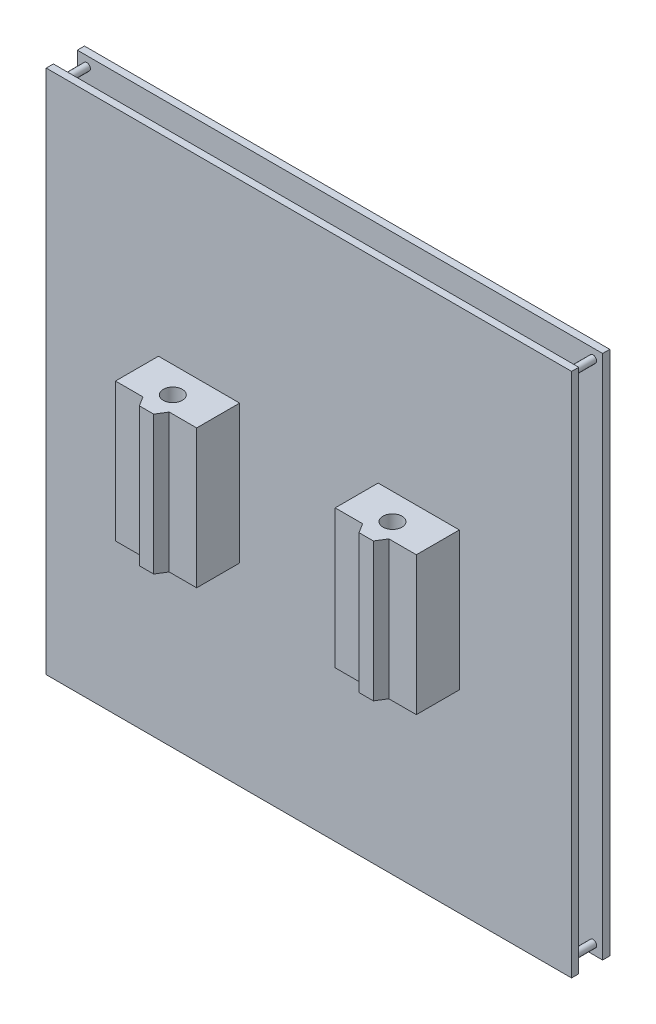
ISO-10303-21;
HEADER;
FILE_DESCRIPTION(('STEP AP214'),'2;1');
FILE_NAME('part.step','',(''),(''),'','','');
FILE_SCHEMA(('AUTOMOTIVE_DESIGN { 1 0 10303 214 1 1 1 1 }'));
ENDSEC;
DATA;
#1=APPLICATION_CONTEXT('core data for automotive mechanical design processes');
#2=APPLICATION_PROTOCOL_DEFINITION('international standard','automotive_design',2000,#1);
#3=PRODUCT_CONTEXT('',#1,'mechanical');
#4=PRODUCT('Part','Part','',(#3));
#5=PRODUCT_RELATED_PRODUCT_CATEGORY('part','',(#4));
#6=PRODUCT_DEFINITION_FORMATION('','',#4);
#7=PRODUCT_DEFINITION_CONTEXT('part definition',#1,'design');
#8=PRODUCT_DEFINITION('design','',#6,#7);
#9=PRODUCT_DEFINITION_SHAPE('','',#8);
#10=(LENGTH_UNIT() NAMED_UNIT(*) SI_UNIT(.MILLI.,.METRE.));
#11=(NAMED_UNIT(*) PLANE_ANGLE_UNIT() SI_UNIT($,.RADIAN.));
#12=(NAMED_UNIT(*) SI_UNIT($,.STERADIAN.) SOLID_ANGLE_UNIT());
#13=UNCERTAINTY_MEASURE_WITH_UNIT(LENGTH_MEASURE(1.E-05),#10,'distance_accuracy_value','');
#14=(GEOMETRIC_REPRESENTATION_CONTEXT(3) GLOBAL_UNCERTAINTY_ASSIGNED_CONTEXT((#13)) GLOBAL_UNIT_ASSIGNED_CONTEXT((#10,
#11,#12)) REPRESENTATION_CONTEXT('',''));
#15=CARTESIAN_POINT('',(0.,0.,0.));
#16=DIRECTION('',(0.,0.,1.));
#17=DIRECTION('',(1.,0.,0.));
#18=AXIS2_PLACEMENT_3D('',#15,#16,#17);
#19=CARTESIAN_POINT('',(63.,29.,38.));
#20=DIRECTION('',(1.,0.,0.));
#21=DIRECTION('',(0.,0.,-1.));
#22=AXIS2_PLACEMENT_3D('',#19,#20,#21);
#23=PLANE('',#22);
#24=DIRECTION('',(0.,0.,-1.));
#25=VECTOR('',#24,1.);
#26=CARTESIAN_POINT('',(63.,29.,38.));
#27=LINE('',#26,#25);
#28=CARTESIAN_POINT('',(63.,29.,34.));
#29=VERTEX_POINT('',#28);
#30=CARTESIAN_POINT('',(63.,29.,16.));
#31=VERTEX_POINT('',#30);
#32=EDGE_CURVE('E254',#29,#31,#27,.T.);
#33=ORIENTED_EDGE('',*,*,#32,.F.);
#34=DIRECTION('',(0.,1.,0.));
#35=VECTOR('',#34,1.);
#36=CARTESIAN_POINT('',(63.,-110.,34.));
#37=LINE('',#36,#35);
#38=CARTESIAN_POINT('',(63.,-29.,34.));
#39=VERTEX_POINT('',#38);
#40=EDGE_CURVE('E217',#39,#29,#37,.T.);
#41=ORIENTED_EDGE('',*,*,#40,.F.);
#42=DIRECTION('',(0.,0.,-1.));
#43=VECTOR('',#42,1.);
#44=CARTESIAN_POINT('',(63.,-29.,38.));
#45=LINE('',#44,#43);
#46=CARTESIAN_POINT('',(63.,-29.,16.));
#47=VERTEX_POINT('',#46);
#48=EDGE_CURVE('E238',#39,#47,#45,.T.);
#49=ORIENTED_EDGE('',*,*,#48,.T.);
#50=DIRECTION('',(0.,-1.,0.));
#51=VECTOR('',#50,1.);
#52=CARTESIAN_POINT('',(63.,29.,16.));
#53=LINE('',#52,#51);
#54=EDGE_CURVE('E232',#31,#47,#53,.T.);
#55=ORIENTED_EDGE('',*,*,#54,.F.);
#56=EDGE_LOOP('',(#33,#41,#49,#55));
#57=FACE_BOUND('',#56,.T.);
#58=ADVANCED_FACE('F33',(#57),#23,.T.);
#59=CARTESIAN_POINT('',(63.,29.,38.));
#60=DIRECTION('',(0.,1.,0.));
#61=DIRECTION('',(0.,0.,1.));
#62=AXIS2_PLACEMENT_3D('',#59,#60,#61);
#63=PLANE('',#62);
#64=CARTESIAN_POINT('',(46.,29.,27.));
#65=DIRECTION('',(0.,1.,0.));
#66=DIRECTION('',(0.,0.,1.));
#67=AXIS2_PLACEMENT_3D('',#64,#65,#66);
#68=CIRCLE('',#67,4.00000000000001);
#69=CARTESIAN_POINT('',(46.,29.,31.));
#70=VERTEX_POINT('',#69);
#71=EDGE_CURVE('E229',#70,#70,#68,.F.);
#72=ORIENTED_EDGE('',*,*,#71,.T.);
#73=EDGE_LOOP('',(#72));
#74=FACE_BOUND('',#73,.T.);
#75=DIRECTION('',(1.,0.,0.));
#76=VECTOR('',#75,1.);
#77=CARTESIAN_POINT('',(63.,29.,38.));
#78=LINE('',#77,#76);
#79=CARTESIAN_POINT('',(43.,29.,38.));
#80=VERTEX_POINT('',#79);
#81=CARTESIAN_POINT('',(49.,29.,38.));
#82=VERTEX_POINT('',#81);
#83=EDGE_CURVE('E233',#80,#82,#78,.T.);
#84=ORIENTED_EDGE('',*,*,#83,.T.);
#85=DIRECTION('',(0.529998940003179,0.,-0.847998304005089));
#86=VECTOR('',#85,1.);
#87=CARTESIAN_POINT('',(52.9325842696629,29.,31.7078651685393));
#88=LINE('',#87,#86);
#89=CARTESIAN_POINT('',(51.5,29.,34.));
#90=VERTEX_POINT('',#89);
#91=EDGE_CURVE('E56',#82,#90,#88,.T.);
#92=ORIENTED_EDGE('',*,*,#91,.T.);
#93=DIRECTION('',(1.,0.,0.));
#94=VECTOR('',#93,1.);
#95=CARTESIAN_POINT('',(63.,29.,34.));
#96=LINE('',#95,#94);
#97=EDGE_CURVE('E225',#90,#29,#96,.T.);
#98=ORIENTED_EDGE('',*,*,#97,.T.);
#99=ORIENTED_EDGE('',*,*,#32,.T.);
#100=DIRECTION('',(1.,0.,0.));
#101=VECTOR('',#100,1.);
#102=CARTESIAN_POINT('',(63.,29.,16.));
#103=LINE('',#102,#101);
#104=CARTESIAN_POINT('',(29.,29.,16.));
#105=VERTEX_POINT('',#104);
#106=EDGE_CURVE('E241',#105,#31,#103,.T.);
#107=ORIENTED_EDGE('',*,*,#106,.F.);
#108=DIRECTION('',(0.,0.,-1.));
#109=VECTOR('',#108,1.);
#110=CARTESIAN_POINT('',(29.,29.,38.));
#111=LINE('',#110,#109);
#112=CARTESIAN_POINT('',(29.,29.,34.));
#113=VERTEX_POINT('',#112);
#114=EDGE_CURVE('E252',#113,#105,#111,.T.);
#115=ORIENTED_EDGE('',*,*,#114,.F.);
#116=DIRECTION('',(1.,0.,0.));
#117=VECTOR('',#116,1.);
#118=CARTESIAN_POINT('',(63.,29.,34.));
#119=LINE('',#118,#117);
#120=CARTESIAN_POINT('',(40.5,29.,34.));
#121=VERTEX_POINT('',#120);
#122=EDGE_CURVE('E223',#113,#121,#119,.T.);
#123=ORIENTED_EDGE('',*,*,#122,.T.);
#124=DIRECTION('',(0.529998940003179,0.,0.847998304005089));
#125=VECTOR('',#124,1.);
#126=CARTESIAN_POINT('',(48.6179775280899,29.,46.9887640449438));
#127=LINE('',#126,#125);
#128=EDGE_CURVE('E206',#121,#80,#127,.T.);
#129=ORIENTED_EDGE('',*,*,#128,.T.);
#130=EDGE_LOOP('',(#84,#92,#98,#99,#107,#115,#123,#129));
#131=FACE_BOUND('',#130,.T.);
#132=ADVANCED_FACE('F419',(#74,#131),#63,.T.);
#133=CARTESIAN_POINT('',(29.,29.,38.));
#134=DIRECTION('',(-1.,0.,0.));
#135=DIRECTION('',(0.,0.,1.));
#136=AXIS2_PLACEMENT_3D('',#133,#134,#135);
#137=PLANE('',#136);
#138=DIRECTION('',(0.,0.,-1.));
#139=VECTOR('',#138,1.);
#140=CARTESIAN_POINT('',(29.,-29.,38.));
#141=LINE('',#140,#139);
#142=CARTESIAN_POINT('',(29.,-29.,34.));
#143=VERTEX_POINT('',#142);
#144=CARTESIAN_POINT('',(29.,-29.,16.));
#145=VERTEX_POINT('',#144);
#146=EDGE_CURVE('E250',#143,#145,#141,.T.);
#147=ORIENTED_EDGE('',*,*,#146,.F.);
#148=DIRECTION('',(0.,1.,0.));
#149=VECTOR('',#148,1.);
#150=CARTESIAN_POINT('',(29.,-110.,34.));
#151=LINE('',#150,#149);
#152=EDGE_CURVE('E200',#143,#113,#151,.T.);
#153=ORIENTED_EDGE('',*,*,#152,.T.);
#154=ORIENTED_EDGE('',*,*,#114,.T.);
#155=DIRECTION('',(0.,1.,0.));
#156=VECTOR('',#155,1.);
#157=CARTESIAN_POINT('',(29.,29.,16.));
#158=LINE('',#157,#156);
#159=EDGE_CURVE('E244',#145,#105,#158,.T.);
#160=ORIENTED_EDGE('',*,*,#159,.F.);
#161=EDGE_LOOP('',(#147,#153,#154,#160));
#162=FACE_BOUND('',#161,.T.);
#163=ADVANCED_FACE('F423',(#162),#137,.T.);
#164=CARTESIAN_POINT('',(63.,-29.,38.));
#165=DIRECTION('',(0.,-1.,0.));
#166=DIRECTION('',(0.,0.,-1.));
#167=AXIS2_PLACEMENT_3D('',#164,#165,#166);
#168=PLANE('',#167);
#169=CARTESIAN_POINT('',(46.,-29.,27.));
#170=DIRECTION('',(0.,-1.,0.));
#171=DIRECTION('',(0.,0.,-1.));
#172=AXIS2_PLACEMENT_3D('',#169,#170,#171);
#173=CIRCLE('',#172,4.00000000000001);
#174=CARTESIAN_POINT('',(46.,-29.,23.));
#175=VERTEX_POINT('',#174);
#176=EDGE_CURVE('E228',#175,#175,#173,.F.);
#177=ORIENTED_EDGE('',*,*,#176,.T.);
#178=EDGE_LOOP('',(#177));
#179=FACE_BOUND('',#178,.T.);
#180=DIRECTION('',(-1.,0.,0.));
#181=VECTOR('',#180,1.);
#182=CARTESIAN_POINT('',(63.,-29.,34.));
#183=LINE('',#182,#181);
#184=CARTESIAN_POINT('',(51.5,-29.,34.));
#185=VERTEX_POINT('',#184);
#186=EDGE_CURVE('E11',#39,#185,#183,.T.);
#187=ORIENTED_EDGE('',*,*,#186,.T.);
#188=DIRECTION('',(-0.529998940003179,0.,0.847998304005089));
#189=VECTOR('',#188,1.);
#190=CARTESIAN_POINT('',(52.9325842696629,-29.,31.7078651685393));
#191=LINE('',#190,#189);
#192=CARTESIAN_POINT('',(49.,-29.,38.));
#193=VERTEX_POINT('',#192);
#194=EDGE_CURVE('E215',#185,#193,#191,.T.);
#195=ORIENTED_EDGE('',*,*,#194,.T.);
#196=DIRECTION('',(-1.,0.,0.));
#197=VECTOR('',#196,1.);
#198=CARTESIAN_POINT('',(63.,-29.,38.));
#199=LINE('',#198,#197);
#200=CARTESIAN_POINT('',(43.,-29.,38.));
#201=VERTEX_POINT('',#200);
#202=EDGE_CURVE('E212',#193,#201,#199,.T.);
#203=ORIENTED_EDGE('',*,*,#202,.T.);
#204=DIRECTION('',(-0.529998940003179,0.,-0.847998304005089));
#205=VECTOR('',#204,1.);
#206=CARTESIAN_POINT('',(48.6179775280899,-29.,46.9887640449438));
#207=LINE('',#206,#205);
#208=CARTESIAN_POINT('',(40.5,-29.,34.));
#209=VERTEX_POINT('',#208);
#210=EDGE_CURVE('E48',#201,#209,#207,.T.);
#211=ORIENTED_EDGE('',*,*,#210,.T.);
#212=DIRECTION('',(-1.,0.,0.));
#213=VECTOR('',#212,1.);
#214=CARTESIAN_POINT('',(63.,-29.,34.));
#215=LINE('',#214,#213);
#216=EDGE_CURVE('E41',#209,#143,#215,.T.);
#217=ORIENTED_EDGE('',*,*,#216,.T.);
#218=ORIENTED_EDGE('',*,*,#146,.T.);
#219=DIRECTION('',(-1.,0.,0.));
#220=VECTOR('',#219,1.);
#221=CARTESIAN_POINT('',(63.,-29.,16.));
#222=LINE('',#221,#220);
#223=EDGE_CURVE('E236',#47,#145,#222,.T.);
#224=ORIENTED_EDGE('',*,*,#223,.F.);
#225=ORIENTED_EDGE('',*,*,#48,.F.);
#226=EDGE_LOOP('',(#187,#195,#203,#211,#217,#218,#224,#225));
#227=FACE_BOUND('',#226,.T.);
#228=ADVANCED_FACE('F209',(#179,#227),#168,.T.);
#229=CARTESIAN_POINT('',(0.,0.,38.));
#230=DIRECTION('',(0.,0.,1.));
#231=DIRECTION('',(-1.,0.,0.));
#232=AXIS2_PLACEMENT_3D('',#229,#230,#231);
#233=PLANE('',#232);
#234=ORIENTED_EDGE('',*,*,#202,.F.);
#235=DIRECTION('',(0.,1.,0.));
#236=VECTOR('',#235,1.);
#237=CARTESIAN_POINT('',(49.,0.,38.));
#238=LINE('',#237,#236);
#239=EDGE_CURVE('E203',#193,#82,#238,.T.);
#240=ORIENTED_EDGE('',*,*,#239,.T.);
#241=ORIENTED_EDGE('',*,*,#83,.F.);
#242=DIRECTION('',(0.,-1.,0.));
#243=VECTOR('',#242,1.);
#244=CARTESIAN_POINT('',(43.,0.,38.));
#245=LINE('',#244,#243);
#246=EDGE_CURVE('E411',#80,#201,#245,.T.);
#247=ORIENTED_EDGE('',*,*,#246,.T.);
#248=EDGE_LOOP('',(#234,#240,#241,#247));
#249=FACE_BOUND('',#248,.T.);
#250=ADVANCED_FACE('F417',(#249),#233,.T.);
#251=CARTESIAN_POINT('',(0.,0.,16.));
#252=DIRECTION('',(0.,0.,1.));
#253=DIRECTION('',(1.,0.,0.));
#254=AXIS2_PLACEMENT_3D('',#251,#252,#253);
#255=PLANE('',#254);
#256=ORIENTED_EDGE('',*,*,#54,.T.);
#257=ORIENTED_EDGE('',*,*,#223,.T.);
#258=ORIENTED_EDGE('',*,*,#159,.T.);
#259=ORIENTED_EDGE('',*,*,#106,.T.);
#260=EDGE_LOOP('',(#256,#257,#258,#259));
#261=FACE_BOUND('',#260,.T.);
#262=DIRECTION('',(0.,-1.,0.));
#263=VECTOR('',#262,1.);
#264=CARTESIAN_POINT('',(-110.,110.,16.));
#265=LINE('',#264,#263);
#266=CARTESIAN_POINT('',(-110.,110.,16.));
#267=VERTEX_POINT('',#266);
#268=CARTESIAN_POINT('',(-110.,-110.,16.));
#269=VERTEX_POINT('',#268);
#270=EDGE_CURVE('E316',#267,#269,#265,.T.);
#271=ORIENTED_EDGE('',*,*,#270,.T.);
#272=DIRECTION('',(1.,0.,0.));
#273=VECTOR('',#272,1.);
#274=CARTESIAN_POINT('',(-110.,-110.,16.));
#275=LINE('',#274,#273);
#276=CARTESIAN_POINT('',(110.,-110.,16.));
#277=VERTEX_POINT('',#276);
#278=EDGE_CURVE('E319',#269,#277,#275,.T.);
#279=ORIENTED_EDGE('',*,*,#278,.T.);
#280=DIRECTION('',(0.,1.,0.));
#281=VECTOR('',#280,1.);
#282=CARTESIAN_POINT('',(110.,110.,16.));
#283=LINE('',#282,#281);
#284=CARTESIAN_POINT('',(110.,110.,16.));
#285=VERTEX_POINT('',#284);
#286=EDGE_CURVE('E322',#277,#285,#283,.T.);
#287=ORIENTED_EDGE('',*,*,#286,.T.);
#288=DIRECTION('',(-1.,0.,0.));
#289=VECTOR('',#288,1.);
#290=CARTESIAN_POINT('',(-110.,110.,16.));
#291=LINE('',#290,#289);
#292=EDGE_CURVE('E324',#285,#267,#291,.T.);
#293=ORIENTED_EDGE('',*,*,#292,.T.);
#294=EDGE_LOOP('',(#271,#279,#287,#293));
#295=FACE_BOUND('',#294,.T.);
#296=DIRECTION('',(1.,0.,0.));
#297=VECTOR('',#296,1.);
#298=CARTESIAN_POINT('',(-63.,-29.,16.));
#299=LINE('',#298,#297);
#300=CARTESIAN_POINT('',(-63.,-29.,16.));
#301=VERTEX_POINT('',#300);
#302=CARTESIAN_POINT('',(-29.,-29.,16.));
#303=VERTEX_POINT('',#302);
#304=EDGE_CURVE('E300',#301,#303,#299,.T.);
#305=ORIENTED_EDGE('',*,*,#304,.F.);
#306=DIRECTION('',(0.,-1.,0.));
#307=VECTOR('',#306,1.);
#308=CARTESIAN_POINT('',(-63.,29.,16.));
#309=LINE('',#308,#307);
#310=CARTESIAN_POINT('',(-63.,29.,16.));
#311=VERTEX_POINT('',#310);
#312=EDGE_CURVE('E289',#311,#301,#309,.T.);
#313=ORIENTED_EDGE('',*,*,#312,.F.);
#314=DIRECTION('',(-1.,0.,0.));
#315=VECTOR('',#314,1.);
#316=CARTESIAN_POINT('',(-63.,29.,16.));
#317=LINE('',#316,#315);
#318=CARTESIAN_POINT('',(-29.,29.,16.));
#319=VERTEX_POINT('',#318);
#320=EDGE_CURVE('E294',#319,#311,#317,.T.);
#321=ORIENTED_EDGE('',*,*,#320,.F.);
#322=DIRECTION('',(0.,1.,0.));
#323=VECTOR('',#322,1.);
#324=CARTESIAN_POINT('',(-29.,29.,16.));
#325=LINE('',#324,#323);
#326=EDGE_CURVE('E303',#303,#319,#325,.T.);
#327=ORIENTED_EDGE('',*,*,#326,.F.);
#328=EDGE_LOOP('',(#305,#313,#321,#327));
#329=FACE_BOUND('',#328,.T.);
#330=ADVANCED_FACE('F436',(#261,#295,#329),#255,.T.);
#331=CARTESIAN_POINT('',(-110.,110.,3.));
#332=DIRECTION('',(1.,0.,0.));
#333=DIRECTION('',(0.,1.,0.));
#334=AXIS2_PLACEMENT_3D('',#331,#332,#333);
#335=PLANE('',#334);
#336=DIRECTION('',(0.,-1.,0.));
#337=VECTOR('',#336,1.);
#338=CARTESIAN_POINT('',(-110.,110.,0.));
#339=LINE('',#338,#337);
#340=CARTESIAN_POINT('',(-110.,110.,0.));
#341=VERTEX_POINT('',#340);
#342=CARTESIAN_POINT('',(-110.,-110.,0.));
#343=VERTEX_POINT('',#342);
#344=EDGE_CURVE('E367',#341,#343,#339,.T.);
#345=ORIENTED_EDGE('',*,*,#344,.T.);
#346=DIRECTION('',(0.,0.,-1.));
#347=VECTOR('',#346,1.);
#348=CARTESIAN_POINT('',(-110.,-110.,3.));
#349=LINE('',#348,#347);
#350=CARTESIAN_POINT('',(-110.,-110.,3.));
#351=VERTEX_POINT('',#350);
#352=EDGE_CURVE('E396',#351,#343,#349,.T.);
#353=ORIENTED_EDGE('',*,*,#352,.F.);
#354=DIRECTION('',(0.,-1.,0.));
#355=VECTOR('',#354,1.);
#356=CARTESIAN_POINT('',(-110.,110.,3.));
#357=LINE('',#356,#355);
#358=CARTESIAN_POINT('',(-110.,110.,3.));
#359=VERTEX_POINT('',#358);
#360=EDGE_CURVE('E370',#359,#351,#357,.T.);
#361=ORIENTED_EDGE('',*,*,#360,.F.);
#362=DIRECTION('',(0.,0.,-1.));
#363=VECTOR('',#362,1.);
#364=CARTESIAN_POINT('',(-110.,110.,3.));
#365=LINE('',#364,#363);
#366=EDGE_CURVE('E380',#359,#341,#365,.T.);
#367=ORIENTED_EDGE('',*,*,#366,.T.);
#368=EDGE_LOOP('',(#345,#353,#361,#367));
#369=FACE_BOUND('',#368,.T.);
#370=ADVANCED_FACE('F35',(#369),#335,.F.);
#371=CARTESIAN_POINT('',(-110.,-110.,3.));
#372=DIRECTION('',(0.,1.,0.));
#373=DIRECTION('',(0.,0.,1.));
#374=AXIS2_PLACEMENT_3D('',#371,#372,#373);
#375=PLANE('',#374);
#376=DIRECTION('',(1.,0.,0.));
#377=VECTOR('',#376,1.);
#378=CARTESIAN_POINT('',(-110.,-110.,0.));
#379=LINE('',#378,#377);
#380=CARTESIAN_POINT('',(110.,-110.,0.));
#381=VERTEX_POINT('',#380);
#382=EDGE_CURVE('E383',#343,#381,#379,.T.);
#383=ORIENTED_EDGE('',*,*,#382,.T.);
#384=DIRECTION('',(0.,0.,-1.));
#385=VECTOR('',#384,1.);
#386=CARTESIAN_POINT('',(110.,-110.,3.));
#387=LINE('',#386,#385);
#388=CARTESIAN_POINT('',(110.,-110.,3.));
#389=VERTEX_POINT('',#388);
#390=EDGE_CURVE('E393',#389,#381,#387,.T.);
#391=ORIENTED_EDGE('',*,*,#390,.F.);
#392=DIRECTION('',(1.,0.,0.));
#393=VECTOR('',#392,1.);
#394=CARTESIAN_POINT('',(-110.,-110.,3.));
#395=LINE('',#394,#393);
#396=EDGE_CURVE('E373',#351,#389,#395,.T.);
#397=ORIENTED_EDGE('',*,*,#396,.F.);
#398=ORIENTED_EDGE('',*,*,#352,.T.);
#399=EDGE_LOOP('',(#383,#391,#397,#398));
#400=FACE_BOUND('',#399,.T.);
#401=ADVANCED_FACE('F549',(#400),#375,.F.);
#402=CARTESIAN_POINT('',(110.,110.,3.));
#403=DIRECTION('',(-1.,0.,0.));
#404=DIRECTION('',(0.,0.,1.));
#405=AXIS2_PLACEMENT_3D('',#402,#403,#404);
#406=PLANE('',#405);
#407=DIRECTION('',(0.,1.,0.));
#408=VECTOR('',#407,1.);
#409=CARTESIAN_POINT('',(110.,110.,0.));
#410=LINE('',#409,#408);
#411=CARTESIAN_POINT('',(110.,110.,0.));
#412=VERTEX_POINT('',#411);
#413=EDGE_CURVE('E385',#381,#412,#410,.T.);
#414=ORIENTED_EDGE('',*,*,#413,.T.);
#415=DIRECTION('',(0.,0.,-1.));
#416=VECTOR('',#415,1.);
#417=CARTESIAN_POINT('',(110.,110.,3.));
#418=LINE('',#417,#416);
#419=CARTESIAN_POINT('',(110.,110.,3.));
#420=VERTEX_POINT('',#419);
#421=EDGE_CURVE('E390',#420,#412,#418,.T.);
#422=ORIENTED_EDGE('',*,*,#421,.F.);
#423=DIRECTION('',(0.,1.,0.));
#424=VECTOR('',#423,1.);
#425=CARTESIAN_POINT('',(110.,110.,3.));
#426=LINE('',#425,#424);
#427=EDGE_CURVE('E376',#389,#420,#426,.T.);
#428=ORIENTED_EDGE('',*,*,#427,.F.);
#429=ORIENTED_EDGE('',*,*,#390,.T.);
#430=EDGE_LOOP('',(#414,#422,#428,#429));
#431=FACE_BOUND('',#430,.T.);
#432=ADVANCED_FACE('F546',(#431),#406,.F.);
#433=CARTESIAN_POINT('',(-110.,110.,3.));
#434=DIRECTION('',(0.,-1.,0.));
#435=DIRECTION('',(0.,0.,-1.));
#436=AXIS2_PLACEMENT_3D('',#433,#434,#435);
#437=PLANE('',#436);
#438=DIRECTION('',(-1.,0.,0.));
#439=VECTOR('',#438,1.);
#440=CARTESIAN_POINT('',(-110.,110.,0.));
#441=LINE('',#440,#439);
#442=EDGE_CURVE('E374',#412,#341,#441,.T.);
#443=ORIENTED_EDGE('',*,*,#442,.T.);
#444=ORIENTED_EDGE('',*,*,#366,.F.);
#445=DIRECTION('',(-1.,0.,0.));
#446=VECTOR('',#445,1.);
#447=CARTESIAN_POINT('',(-110.,110.,3.));
#448=LINE('',#447,#446);
#449=EDGE_CURVE('E378',#420,#359,#448,.T.);
#450=ORIENTED_EDGE('',*,*,#449,.F.);
#451=ORIENTED_EDGE('',*,*,#421,.T.);
#452=EDGE_LOOP('',(#443,#444,#450,#451));
#453=FACE_BOUND('',#452,.T.);
#454=ADVANCED_FACE('F540',(#453),#437,.F.);
#455=CARTESIAN_POINT('',(0.,0.,3.));
#456=DIRECTION('',(0.,0.,1.));
#457=DIRECTION('',(1.,0.,0.));
#458=AXIS2_PLACEMENT_3D('',#455,#456,#457);
#459=PLANE('',#458);
#460=CARTESIAN_POINT('',(-105.999999999994,-106.,3.));
#461=DIRECTION('',(0.,0.,1.));
#462=DIRECTION('',(1.,0.,0.));
#463=AXIS2_PLACEMENT_3D('',#460,#461,#462);
#464=CIRCLE('',#463,1.50000000000314);
#465=CARTESIAN_POINT('',(-104.499999999991,-106.,3.));
#466=VERTEX_POINT('',#465);
#467=EDGE_CURVE('E345',#466,#466,#464,.T.);
#468=ORIENTED_EDGE('',*,*,#467,.F.);
#469=EDGE_LOOP('',(#468));
#470=FACE_BOUND('',#469,.T.);
#471=CARTESIAN_POINT('',(106.000000000006,-105.999999999994,3.));
#472=DIRECTION('',(0.,0.,1.));
#473=DIRECTION('',(1.,0.,0.));
#474=AXIS2_PLACEMENT_3D('',#471,#472,#473);
#475=CIRCLE('',#474,1.50000000000836);
#476=CARTESIAN_POINT('',(107.500000000014,-105.999999999994,3.));
#477=VERTEX_POINT('',#476);
#478=EDGE_CURVE('E349',#477,#477,#475,.T.);
#479=ORIENTED_EDGE('',*,*,#478,.F.);
#480=EDGE_LOOP('',(#479));
#481=FACE_BOUND('',#480,.T.);
#482=CARTESIAN_POINT('',(106.,106.000000000006,3.));
#483=DIRECTION('',(0.,0.,1.));
#484=DIRECTION('',(1.,0.,0.));
#485=AXIS2_PLACEMENT_3D('',#482,#483,#484);
#486=CIRCLE('',#485,1.50000000000617);
#487=CARTESIAN_POINT('',(107.500000000006,106.000000000006,3.));
#488=VERTEX_POINT('',#487);
#489=EDGE_CURVE('E355',#488,#488,#486,.T.);
#490=ORIENTED_EDGE('',*,*,#489,.F.);
#491=EDGE_LOOP('',(#490));
#492=FACE_BOUND('',#491,.T.);
#493=CARTESIAN_POINT('',(-106.,106.,3.));
#494=DIRECTION('',(0.,0.,1.));
#495=DIRECTION('',(1.,0.,0.));
#496=AXIS2_PLACEMENT_3D('',#493,#494,#495);
#497=CIRCLE('',#496,1.5);
#498=CARTESIAN_POINT('',(-104.5,106.,3.));
#499=VERTEX_POINT('',#498);
#500=EDGE_CURVE('E361',#499,#499,#497,.T.);
#501=ORIENTED_EDGE('',*,*,#500,.F.);
#502=EDGE_LOOP('',(#501));
#503=FACE_BOUND('',#502,.T.);
#504=ORIENTED_EDGE('',*,*,#360,.T.);
#505=ORIENTED_EDGE('',*,*,#396,.T.);
#506=ORIENTED_EDGE('',*,*,#427,.T.);
#507=ORIENTED_EDGE('',*,*,#449,.T.);
#508=EDGE_LOOP('',(#504,#505,#506,#507));
#509=FACE_BOUND('',#508,.T.);
#510=ADVANCED_FACE('F537',(#470,#481,#492,#503,#509),#459,.T.);
#511=CARTESIAN_POINT('',(0.,0.,0.));
#512=DIRECTION('',(0.,0.,1.));
#513=DIRECTION('',(1.,0.,0.));
#514=AXIS2_PLACEMENT_3D('',#511,#512,#513);
#515=PLANE('',#514);
#516=ORIENTED_EDGE('',*,*,#344,.F.);
#517=ORIENTED_EDGE('',*,*,#442,.F.);
#518=ORIENTED_EDGE('',*,*,#413,.F.);
#519=ORIENTED_EDGE('',*,*,#382,.F.);
#520=EDGE_LOOP('',(#516,#517,#518,#519));
#521=FACE_BOUND('',#520,.T.);
#522=ADVANCED_FACE('F535',(#521),#515,.F.);
#523=CARTESIAN_POINT('',(-106.,106.,13.));
#524=DIRECTION('',(0.,0.,-1.));
#525=DIRECTION('',(-1.,0.,0.));
#526=AXIS2_PLACEMENT_3D('',#523,#524,#525);
#527=CYLINDRICAL_SURFACE('',#526,1.5);
#528=CARTESIAN_POINT('',(-106.,106.,13.));
#529=DIRECTION('',(0.,0.,1.));
#530=DIRECTION('',(1.,0.,0.));
#531=AXIS2_PLACEMENT_3D('',#528,#529,#530);
#532=CIRCLE('',#531,1.5);
#533=CARTESIAN_POINT('',(-104.5,106.,13.));
#534=VERTEX_POINT('',#533);
#535=EDGE_CURVE('E364',#534,#534,#532,.T.);
#536=ORIENTED_EDGE('',*,*,#535,.F.);
#537=EDGE_LOOP('',(#536));
#538=FACE_BOUND('',#537,.T.);
#539=ORIENTED_EDGE('',*,*,#500,.T.);
#540=EDGE_LOOP('',(#539));
#541=FACE_BOUND('',#540,.T.);
#542=ADVANCED_FACE('F531',(#538,#541),#527,.T.);
#543=CARTESIAN_POINT('',(106.,106.000000000006,13.));
#544=DIRECTION('',(0.,0.,-1.));
#545=DIRECTION('',(-1.,0.,0.));
#546=AXIS2_PLACEMENT_3D('',#543,#544,#545);
#547=CYLINDRICAL_SURFACE('',#546,1.50000000000617);
#548=CARTESIAN_POINT('',(106.,106.000000000006,13.));
#549=DIRECTION('',(0.,0.,1.));
#550=DIRECTION('',(1.,0.,0.));
#551=AXIS2_PLACEMENT_3D('',#548,#549,#550);
#552=CIRCLE('',#551,1.50000000000617);
#553=CARTESIAN_POINT('',(107.500000000006,106.000000000006,13.));
#554=VERTEX_POINT('',#553);
#555=EDGE_CURVE('E358',#554,#554,#552,.T.);
#556=ORIENTED_EDGE('',*,*,#555,.F.);
#557=EDGE_LOOP('',(#556));
#558=FACE_BOUND('',#557,.T.);
#559=ORIENTED_EDGE('',*,*,#489,.T.);
#560=EDGE_LOOP('',(#559));
#561=FACE_BOUND('',#560,.T.);
#562=ADVANCED_FACE('F527',(#558,#561),#547,.T.);
#563=CARTESIAN_POINT('',(106.000000000006,-105.999999999994,13.));
#564=DIRECTION('',(0.,0.,-1.));
#565=DIRECTION('',(-1.,0.,0.));
#566=AXIS2_PLACEMENT_3D('',#563,#564,#565);
#567=CYLINDRICAL_SURFACE('',#566,1.50000000000836);
#568=CARTESIAN_POINT('',(106.000000000006,-105.999999999994,13.));
#569=DIRECTION('',(0.,0.,1.));
#570=DIRECTION('',(1.,0.,0.));
#571=AXIS2_PLACEMENT_3D('',#568,#569,#570);
#572=CIRCLE('',#571,1.50000000000836);
#573=CARTESIAN_POINT('',(107.500000000014,-105.999999999994,13.));
#574=VERTEX_POINT('',#573);
#575=EDGE_CURVE('E352',#574,#574,#572,.T.);
#576=ORIENTED_EDGE('',*,*,#575,.F.);
#577=EDGE_LOOP('',(#576));
#578=FACE_BOUND('',#577,.T.);
#579=ORIENTED_EDGE('',*,*,#478,.T.);
#580=EDGE_LOOP('',(#579));
#581=FACE_BOUND('',#580,.T.);
#582=ADVANCED_FACE('F523',(#578,#581),#567,.T.);
#583=CARTESIAN_POINT('',(-105.999999999994,-106.,13.));
#584=DIRECTION('',(0.,0.,-1.));
#585=DIRECTION('',(-1.,0.,0.));
#586=AXIS2_PLACEMENT_3D('',#583,#584,#585);
#587=CYLINDRICAL_SURFACE('',#586,1.50000000000314);
#588=CARTESIAN_POINT('',(-105.999999999994,-106.,13.));
#589=DIRECTION('',(0.,0.,1.));
#590=DIRECTION('',(1.,0.,0.));
#591=AXIS2_PLACEMENT_3D('',#588,#589,#590);
#592=CIRCLE('',#591,1.50000000000314);
#593=CARTESIAN_POINT('',(-104.499999999991,-106.,13.));
#594=VERTEX_POINT('',#593);
#595=EDGE_CURVE('E346',#594,#594,#592,.T.);
#596=ORIENTED_EDGE('',*,*,#595,.F.);
#597=EDGE_LOOP('',(#596));
#598=FACE_BOUND('',#597,.T.);
#599=ORIENTED_EDGE('',*,*,#467,.T.);
#600=EDGE_LOOP('',(#599));
#601=FACE_BOUND('',#600,.T.);
#602=ADVANCED_FACE('F519',(#598,#601),#587,.T.);
#603=CARTESIAN_POINT('',(-110.,110.,16.));
#604=DIRECTION('',(1.,0.,0.));
#605=DIRECTION('',(0.,0.,-1.));
#606=AXIS2_PLACEMENT_3D('',#603,#604,#605);
#607=PLANE('',#606);
#608=DIRECTION('',(0.,-1.,0.));
#609=VECTOR('',#608,1.);
#610=CARTESIAN_POINT('',(-110.,110.,13.));
#611=LINE('',#610,#609);
#612=CARTESIAN_POINT('',(-110.,110.,13.));
#613=VERTEX_POINT('',#612);
#614=CARTESIAN_POINT('',(-110.,-110.,13.));
#615=VERTEX_POINT('',#614);
#616=EDGE_CURVE('E315',#613,#615,#611,.T.);
#617=ORIENTED_EDGE('',*,*,#616,.T.);
#618=DIRECTION('',(0.,0.,-1.));
#619=VECTOR('',#618,1.);
#620=CARTESIAN_POINT('',(-110.,-110.,16.));
#621=LINE('',#620,#619);
#622=EDGE_CURVE('E342',#269,#615,#621,.T.);
#623=ORIENTED_EDGE('',*,*,#622,.F.);
#624=ORIENTED_EDGE('',*,*,#270,.F.);
#625=DIRECTION('',(0.,0.,-1.));
#626=VECTOR('',#625,1.);
#627=CARTESIAN_POINT('',(-110.,110.,16.));
#628=LINE('',#627,#626);
#629=EDGE_CURVE('E326',#267,#613,#628,.T.);
#630=ORIENTED_EDGE('',*,*,#629,.T.);
#631=EDGE_LOOP('',(#617,#623,#624,#630));
#632=FACE_BOUND('',#631,.T.);
#633=ADVANCED_FACE('F515',(#632),#607,.F.);
#634=CARTESIAN_POINT('',(-110.,-110.,16.));
#635=DIRECTION('',(0.,1.,0.));
#636=DIRECTION('',(0.,0.,1.));
#637=AXIS2_PLACEMENT_3D('',#634,#635,#636);
#638=PLANE('',#637);
#639=DIRECTION('',(1.,0.,0.));
#640=VECTOR('',#639,1.);
#641=CARTESIAN_POINT('',(-110.,-110.,13.));
#642=LINE('',#641,#640);
#643=CARTESIAN_POINT('',(110.,-110.,13.));
#644=VERTEX_POINT('',#643);
#645=EDGE_CURVE('E329',#615,#644,#642,.T.);
#646=ORIENTED_EDGE('',*,*,#645,.T.);
#647=DIRECTION('',(0.,0.,-1.));
#648=VECTOR('',#647,1.);
#649=CARTESIAN_POINT('',(110.,-110.,16.));
#650=LINE('',#649,#648);
#651=EDGE_CURVE('E339',#277,#644,#650,.T.);
#652=ORIENTED_EDGE('',*,*,#651,.F.);
#653=ORIENTED_EDGE('',*,*,#278,.F.);
#654=ORIENTED_EDGE('',*,*,#622,.T.);
#655=EDGE_LOOP('',(#646,#652,#653,#654));
#656=FACE_BOUND('',#655,.T.);
#657=ADVANCED_FACE('F511',(#656),#638,.F.);
#658=CARTESIAN_POINT('',(110.,110.,16.));
#659=DIRECTION('',(-1.,0.,0.));
#660=DIRECTION('',(0.,0.,1.));
#661=AXIS2_PLACEMENT_3D('',#658,#659,#660);
#662=PLANE('',#661);
#663=DIRECTION('',(0.,1.,0.));
#664=VECTOR('',#663,1.);
#665=CARTESIAN_POINT('',(110.,110.,13.));
#666=LINE('',#665,#664);
#667=CARTESIAN_POINT('',(110.,110.,13.));
#668=VERTEX_POINT('',#667);
#669=EDGE_CURVE('E331',#644,#668,#666,.T.);
#670=ORIENTED_EDGE('',*,*,#669,.T.);
#671=DIRECTION('',(0.,0.,-1.));
#672=VECTOR('',#671,1.);
#673=CARTESIAN_POINT('',(110.,110.,16.));
#674=LINE('',#673,#672);
#675=EDGE_CURVE('E336',#285,#668,#674,.T.);
#676=ORIENTED_EDGE('',*,*,#675,.F.);
#677=ORIENTED_EDGE('',*,*,#286,.F.);
#678=ORIENTED_EDGE('',*,*,#651,.T.);
#679=EDGE_LOOP('',(#670,#676,#677,#678));
#680=FACE_BOUND('',#679,.T.);
#681=ADVANCED_FACE('F507',(#680),#662,.F.);
#682=CARTESIAN_POINT('',(-110.,110.,16.));
#683=DIRECTION('',(0.,-1.,0.));
#684=DIRECTION('',(0.,0.,-1.));
#685=AXIS2_PLACEMENT_3D('',#682,#683,#684);
#686=PLANE('',#685);
#687=DIRECTION('',(-1.,0.,0.));
#688=VECTOR('',#687,1.);
#689=CARTESIAN_POINT('',(-110.,110.,13.));
#690=LINE('',#689,#688);
#691=EDGE_CURVE('E320',#668,#613,#690,.T.);
#692=ORIENTED_EDGE('',*,*,#691,.T.);
#693=ORIENTED_EDGE('',*,*,#629,.F.);
#694=ORIENTED_EDGE('',*,*,#292,.F.);
#695=ORIENTED_EDGE('',*,*,#675,.T.);
#696=EDGE_LOOP('',(#692,#693,#694,#695));
#697=FACE_BOUND('',#696,.T.);
#698=ADVANCED_FACE('F503',(#697),#686,.F.);
#699=CARTESIAN_POINT('',(0.,0.,13.));
#700=DIRECTION('',(0.,0.,1.));
#701=DIRECTION('',(1.,0.,0.));
#702=AXIS2_PLACEMENT_3D('',#699,#700,#701);
#703=PLANE('',#702);
#704=ORIENTED_EDGE('',*,*,#535,.T.);
#705=EDGE_LOOP('',(#704));
#706=FACE_BOUND('',#705,.T.);
#707=ORIENTED_EDGE('',*,*,#555,.T.);
#708=EDGE_LOOP('',(#707));
#709=FACE_BOUND('',#708,.T.);
#710=ORIENTED_EDGE('',*,*,#575,.T.);
#711=EDGE_LOOP('',(#710));
#712=FACE_BOUND('',#711,.T.);
#713=ORIENTED_EDGE('',*,*,#595,.T.);
#714=EDGE_LOOP('',(#713));
#715=FACE_BOUND('',#714,.T.);
#716=ORIENTED_EDGE('',*,*,#616,.F.);
#717=ORIENTED_EDGE('',*,*,#691,.F.);
#718=ORIENTED_EDGE('',*,*,#669,.F.);
#719=ORIENTED_EDGE('',*,*,#645,.F.);
#720=EDGE_LOOP('',(#716,#717,#718,#719));
#721=FACE_BOUND('',#720,.T.);
#722=ADVANCED_FACE('F497',(#706,#709,#712,#715,#721),#703,.F.);
#723=CARTESIAN_POINT('',(-63.,29.,38.));
#724=DIRECTION('',(1.,0.,0.));
#725=DIRECTION('',(0.,0.,-1.));
#726=AXIS2_PLACEMENT_3D('',#723,#724,#725);
#727=PLANE('',#726);
#728=DIRECTION('',(0.,0.,-1.));
#729=VECTOR('',#728,1.);
#730=CARTESIAN_POINT('',(-63.,-29.,38.));
#731=LINE('',#730,#729);
#732=CARTESIAN_POINT('',(-63.,-29.,34.));
#733=VERTEX_POINT('',#732);
#734=EDGE_CURVE('E313',#733,#301,#731,.T.);
#735=ORIENTED_EDGE('',*,*,#734,.F.);
#736=DIRECTION('',(0.,1.,0.));
#737=VECTOR('',#736,1.);
#738=CARTESIAN_POINT('',(-63.,-110.,34.));
#739=LINE('',#738,#737);
#740=CARTESIAN_POINT('',(-63.,29.,34.));
#741=VERTEX_POINT('',#740);
#742=EDGE_CURVE('E257',#733,#741,#739,.T.);
#743=ORIENTED_EDGE('',*,*,#742,.T.);
#744=DIRECTION('',(0.,0.,-1.));
#745=VECTOR('',#744,1.);
#746=CARTESIAN_POINT('',(-63.,29.,38.));
#747=LINE('',#746,#745);
#748=EDGE_CURVE('E297',#741,#311,#747,.T.);
#749=ORIENTED_EDGE('',*,*,#748,.T.);
#750=ORIENTED_EDGE('',*,*,#312,.T.);
#751=EDGE_LOOP('',(#735,#743,#749,#750));
#752=FACE_BOUND('',#751,.T.);
#753=ADVANCED_FACE('F493',(#752),#727,.F.);
#754=CARTESIAN_POINT('',(-63.,-29.,38.));
#755=DIRECTION('',(0.,1.,0.));
#756=DIRECTION('',(0.,0.,1.));
#757=AXIS2_PLACEMENT_3D('',#754,#755,#756);
#758=PLANE('',#757);
#759=CARTESIAN_POINT('',(-46.,-29.,27.));
#760=DIRECTION('',(0.,1.,0.));
#761=DIRECTION('',(0.,0.,1.));
#762=AXIS2_PLACEMENT_3D('',#759,#760,#761);
#763=CIRCLE('',#762,4.00000000000001);
#764=CARTESIAN_POINT('',(-46.,-29.,31.));
#765=VERTEX_POINT('',#764);
#766=EDGE_CURVE('E286',#765,#765,#763,.T.);
#767=ORIENTED_EDGE('',*,*,#766,.T.);
#768=EDGE_LOOP('',(#767));
#769=FACE_BOUND('',#768,.T.);
#770=DIRECTION('',(-0.529998940003179,0.,-0.847998304005089));
#771=VECTOR('',#770,1.);
#772=CARTESIAN_POINT('',(-52.9325842696629,-29.,31.7078651685393));
#773=LINE('',#772,#771);
#774=CARTESIAN_POINT('',(-49.,-29.,38.));
#775=VERTEX_POINT('',#774);
#776=CARTESIAN_POINT('',(-51.5,-29.,34.));
#777=VERTEX_POINT('',#776);
#778=EDGE_CURVE('E276',#775,#777,#773,.T.);
#779=ORIENTED_EDGE('',*,*,#778,.T.);
#780=DIRECTION('',(-1.,0.,0.));
#781=VECTOR('',#780,1.);
#782=CARTESIAN_POINT('',(-63.,-29.,34.));
#783=LINE('',#782,#781);
#784=EDGE_CURVE('E282',#777,#733,#783,.T.);
#785=ORIENTED_EDGE('',*,*,#784,.T.);
#786=ORIENTED_EDGE('',*,*,#734,.T.);
#787=ORIENTED_EDGE('',*,*,#304,.T.);
#788=DIRECTION('',(0.,0.,-1.));
#789=VECTOR('',#788,1.);
#790=CARTESIAN_POINT('',(-29.,-29.,38.));
#791=LINE('',#790,#789);
#792=CARTESIAN_POINT('',(-29.,-29.,34.));
#793=VERTEX_POINT('',#792);
#794=EDGE_CURVE('E311',#793,#303,#791,.T.);
#795=ORIENTED_EDGE('',*,*,#794,.F.);
#796=DIRECTION('',(-1.,0.,0.));
#797=VECTOR('',#796,1.);
#798=CARTESIAN_POINT('',(-63.,-29.,34.));
#799=LINE('',#798,#797);
#800=CARTESIAN_POINT('',(-40.5,-29.,34.));
#801=VERTEX_POINT('',#800);
#802=EDGE_CURVE('E279',#793,#801,#799,.T.);
#803=ORIENTED_EDGE('',*,*,#802,.T.);
#804=DIRECTION('',(-0.529998940003179,0.,0.847998304005089));
#805=VECTOR('',#804,1.);
#806=CARTESIAN_POINT('',(-48.6179775280899,-29.,46.9887640449438));
#807=LINE('',#806,#805);
#808=CARTESIAN_POINT('',(-43.,-29.,38.));
#809=VERTEX_POINT('',#808);
#810=EDGE_CURVE('E270',#801,#809,#807,.T.);
#811=ORIENTED_EDGE('',*,*,#810,.T.);
#812=DIRECTION('',(1.,0.,0.));
#813=VECTOR('',#812,1.);
#814=CARTESIAN_POINT('',(-63.,-29.,38.));
#815=LINE('',#814,#813);
#816=EDGE_CURVE('E290',#775,#809,#815,.T.);
#817=ORIENTED_EDGE('',*,*,#816,.F.);
#818=EDGE_LOOP('',(#779,#785,#786,#787,#795,#803,#811,#817));
#819=FACE_BOUND('',#818,.T.);
#820=ADVANCED_FACE('F489',(#769,#819),#758,.F.);
#821=CARTESIAN_POINT('',(-29.,29.,38.));
#822=DIRECTION('',(-1.,0.,0.));
#823=DIRECTION('',(0.,0.,1.));
#824=AXIS2_PLACEMENT_3D('',#821,#822,#823);
#825=PLANE('',#824);
#826=DIRECTION('',(0.,0.,-1.));
#827=VECTOR('',#826,1.);
#828=CARTESIAN_POINT('',(-29.,29.,38.));
#829=LINE('',#828,#827);
#830=CARTESIAN_POINT('',(-29.,29.,34.));
#831=VERTEX_POINT('',#830);
#832=EDGE_CURVE('E309',#831,#319,#829,.T.);
#833=ORIENTED_EDGE('',*,*,#832,.F.);
#834=DIRECTION('',(0.,1.,0.));
#835=VECTOR('',#834,1.);
#836=CARTESIAN_POINT('',(-29.,-110.,34.));
#837=LINE('',#836,#835);
#838=EDGE_CURVE('E256',#793,#831,#837,.T.);
#839=ORIENTED_EDGE('',*,*,#838,.F.);
#840=ORIENTED_EDGE('',*,*,#794,.T.);
#841=ORIENTED_EDGE('',*,*,#326,.T.);
#842=EDGE_LOOP('',(#833,#839,#840,#841));
#843=FACE_BOUND('',#842,.T.);
#844=ADVANCED_FACE('F485',(#843),#825,.F.);
#845=CARTESIAN_POINT('',(-63.,29.,38.));
#846=DIRECTION('',(0.,-1.,0.));
#847=DIRECTION('',(0.,0.,-1.));
#848=AXIS2_PLACEMENT_3D('',#845,#846,#847);
#849=PLANE('',#848);
#850=CARTESIAN_POINT('',(-46.,29.,27.));
#851=DIRECTION('',(0.,-1.,0.));
#852=DIRECTION('',(0.,0.,-1.));
#853=AXIS2_PLACEMENT_3D('',#850,#851,#852);
#854=CIRCLE('',#853,4.00000000000001);
#855=CARTESIAN_POINT('',(-46.,29.,23.));
#856=VERTEX_POINT('',#855);
#857=EDGE_CURVE('E285',#856,#856,#854,.T.);
#858=ORIENTED_EDGE('',*,*,#857,.T.);
#859=EDGE_LOOP('',(#858));
#860=FACE_BOUND('',#859,.T.);
#861=ORIENTED_EDGE('',*,*,#748,.F.);
#862=DIRECTION('',(1.,0.,0.));
#863=VECTOR('',#862,1.);
#864=CARTESIAN_POINT('',(-63.,29.,34.));
#865=LINE('',#864,#863);
#866=CARTESIAN_POINT('',(-51.5,29.,34.));
#867=VERTEX_POINT('',#866);
#868=EDGE_CURVE('E408',#741,#867,#865,.T.);
#869=ORIENTED_EDGE('',*,*,#868,.T.);
#870=DIRECTION('',(0.529998940003179,0.,0.847998304005089));
#871=VECTOR('',#870,1.);
#872=CARTESIAN_POINT('',(-52.9325842696629,29.,31.7078651685393));
#873=LINE('',#872,#871);
#874=CARTESIAN_POINT('',(-49.,29.,38.));
#875=VERTEX_POINT('',#874);
#876=EDGE_CURVE('E273',#867,#875,#873,.T.);
#877=ORIENTED_EDGE('',*,*,#876,.T.);
#878=DIRECTION('',(-1.,0.,0.));
#879=VECTOR('',#878,1.);
#880=CARTESIAN_POINT('',(-63.,29.,38.));
#881=LINE('',#880,#879);
#882=CARTESIAN_POINT('',(-43.,29.,38.));
#883=VERTEX_POINT('',#882);
#884=EDGE_CURVE('E293',#883,#875,#881,.T.);
#885=ORIENTED_EDGE('',*,*,#884,.F.);
#886=DIRECTION('',(0.529998940003179,0.,-0.847998304005089));
#887=VECTOR('',#886,1.);
#888=CARTESIAN_POINT('',(-48.6179775280899,29.,46.9887640449438));
#889=LINE('',#888,#887);
#890=CARTESIAN_POINT('',(-40.5,29.,34.));
#891=VERTEX_POINT('',#890);
#892=EDGE_CURVE('E260',#883,#891,#889,.T.);
#893=ORIENTED_EDGE('',*,*,#892,.T.);
#894=DIRECTION('',(1.,0.,0.));
#895=VECTOR('',#894,1.);
#896=CARTESIAN_POINT('',(-63.,29.,34.));
#897=LINE('',#896,#895);
#898=EDGE_CURVE('E405',#891,#831,#897,.T.);
#899=ORIENTED_EDGE('',*,*,#898,.T.);
#900=ORIENTED_EDGE('',*,*,#832,.T.);
#901=ORIENTED_EDGE('',*,*,#320,.T.);
#902=EDGE_LOOP('',(#861,#869,#877,#885,#893,#899,#900,#901));
#903=FACE_BOUND('',#902,.T.);
#904=ADVANCED_FACE('F481',(#860,#903),#849,.F.);
#905=CARTESIAN_POINT('',(0.,0.,38.));
#906=DIRECTION('',(0.,0.,1.));
#907=DIRECTION('',(1.,0.,0.));
#908=AXIS2_PLACEMENT_3D('',#905,#906,#907);
#909=PLANE('',#908);
#910=DIRECTION('',(0.,1.,0.));
#911=VECTOR('',#910,1.);
#912=CARTESIAN_POINT('',(-49.,0.,38.));
#913=LINE('',#912,#911);
#914=EDGE_CURVE('E403',#775,#875,#913,.T.);
#915=ORIENTED_EDGE('',*,*,#914,.F.);
#916=ORIENTED_EDGE('',*,*,#816,.T.);
#917=DIRECTION('',(0.,-1.,0.));
#918=VECTOR('',#917,1.);
#919=CARTESIAN_POINT('',(-43.,0.,38.));
#920=LINE('',#919,#918);
#921=EDGE_CURVE('E399',#883,#809,#920,.T.);
#922=ORIENTED_EDGE('',*,*,#921,.F.);
#923=ORIENTED_EDGE('',*,*,#884,.T.);
#924=EDGE_LOOP('',(#915,#916,#922,#923));
#925=FACE_BOUND('',#924,.T.);
#926=ADVANCED_FACE('F477',(#925),#909,.T.);
#927=CARTESIAN_POINT('',(-46.,-110.,27.));
#928=DIRECTION('',(0.,1.,0.));
#929=DIRECTION('',(0.,0.,1.));
#930=AXIS2_PLACEMENT_3D('',#927,#928,#929);
#931=CYLINDRICAL_SURFACE('',#930,4.00000000000001);
#932=ORIENTED_EDGE('',*,*,#857,.F.);
#933=EDGE_LOOP('',(#932));
#934=FACE_BOUND('',#933,.T.);
#935=ORIENTED_EDGE('',*,*,#766,.F.);
#936=EDGE_LOOP('',(#935));
#937=FACE_BOUND('',#936,.T.);
#938=ADVANCED_FACE('F473',(#934,#937),#931,.F.);
#939=CARTESIAN_POINT('',(-29.,-110.,34.));
#940=DIRECTION('',(0.,0.,-1.));
#941=DIRECTION('',(-1.,0.,0.));
#942=AXIS2_PLACEMENT_3D('',#939,#940,#941);
#943=PLANE('',#942);
#944=ORIENTED_EDGE('',*,*,#838,.T.);
#945=ORIENTED_EDGE('',*,*,#898,.F.);
#946=DIRECTION('',(0.,1.,0.));
#947=VECTOR('',#946,1.);
#948=CARTESIAN_POINT('',(-40.5,-110.,34.));
#949=LINE('',#948,#947);
#950=EDGE_CURVE('E264',#801,#891,#949,.T.);
#951=ORIENTED_EDGE('',*,*,#950,.F.);
#952=ORIENTED_EDGE('',*,*,#802,.F.);
#953=EDGE_LOOP('',(#944,#945,#951,#952));
#954=FACE_BOUND('',#953,.T.);
#955=ADVANCED_FACE('F469',(#954),#943,.F.);
#956=CARTESIAN_POINT('',(-40.5,-110.,34.));
#957=DIRECTION('',(-0.847998304005088,0.,-0.529998940003179));
#958=DIRECTION('',(-0.529998940003179,0.,0.847998304005089));
#959=AXIS2_PLACEMENT_3D('',#956,#957,#958);
#960=PLANE('',#959);
#961=ORIENTED_EDGE('',*,*,#950,.T.);
#962=ORIENTED_EDGE('',*,*,#892,.F.);
#963=ORIENTED_EDGE('',*,*,#921,.T.);
#964=ORIENTED_EDGE('',*,*,#810,.F.);
#965=EDGE_LOOP('',(#961,#962,#963,#964));
#966=FACE_BOUND('',#965,.T.);
#967=ADVANCED_FACE('F461',(#966),#960,.F.);
#968=CARTESIAN_POINT('',(-63.,-110.,34.));
#969=DIRECTION('',(0.,0.,-1.));
#970=DIRECTION('',(-1.,0.,0.));
#971=AXIS2_PLACEMENT_3D('',#968,#969,#970);
#972=PLANE('',#971);
#973=DIRECTION('',(0.,1.,0.));
#974=VECTOR('',#973,1.);
#975=CARTESIAN_POINT('',(-51.5,-110.,34.));
#976=LINE('',#975,#974);
#977=EDGE_CURVE('E261',#777,#867,#976,.T.);
#978=ORIENTED_EDGE('',*,*,#977,.T.);
#979=ORIENTED_EDGE('',*,*,#868,.F.);
#980=ORIENTED_EDGE('',*,*,#742,.F.);
#981=ORIENTED_EDGE('',*,*,#784,.F.);
#982=EDGE_LOOP('',(#978,#979,#980,#981));
#983=FACE_BOUND('',#982,.T.);
#984=ADVANCED_FACE('F457',(#983),#972,.F.);
#985=CARTESIAN_POINT('',(-51.5,-110.,34.));
#986=DIRECTION('',(0.847998304005088,0.,-0.529998940003179));
#987=DIRECTION('',(-0.529998940003179,0.,-0.847998304005089));
#988=AXIS2_PLACEMENT_3D('',#985,#986,#987);
#989=PLANE('',#988);
#990=ORIENTED_EDGE('',*,*,#914,.T.);
#991=ORIENTED_EDGE('',*,*,#876,.F.);
#992=ORIENTED_EDGE('',*,*,#977,.F.);
#993=ORIENTED_EDGE('',*,*,#778,.F.);
#994=EDGE_LOOP('',(#990,#991,#992,#993));
#995=FACE_BOUND('',#994,.T.);
#996=ADVANCED_FACE('F460',(#995),#989,.F.);
#997=CARTESIAN_POINT('',(46.,-110.,27.));
#998=DIRECTION('',(0.,1.,0.));
#999=DIRECTION('',(0.,0.,1.));
#1000=AXIS2_PLACEMENT_3D('',#997,#998,#999);
#1001=CYLINDRICAL_SURFACE('',#1000,4.00000000000001);
#1002=ORIENTED_EDGE('',*,*,#71,.F.);
#1003=EDGE_LOOP('',(#1002));
#1004=FACE_BOUND('',#1003,.T.);
#1005=ORIENTED_EDGE('',*,*,#176,.F.);
#1006=EDGE_LOOP('',(#1005));
#1007=FACE_BOUND('',#1006,.T.);
#1008=ADVANCED_FACE('F465',(#1004,#1007),#1001,.F.);
#1009=CARTESIAN_POINT('',(29.,-110.,34.));
#1010=DIRECTION('',(0.,0.,1.));
#1011=DIRECTION('',(1.,0.,0.));
#1012=AXIS2_PLACEMENT_3D('',#1009,#1010,#1011);
#1013=PLANE('',#1012);
#1014=ORIENTED_EDGE('',*,*,#152,.F.);
#1015=ORIENTED_EDGE('',*,*,#216,.F.);
#1016=DIRECTION('',(0.,1.,0.));
#1017=VECTOR('',#1016,1.);
#1018=CARTESIAN_POINT('',(40.5,-110.,34.));
#1019=LINE('',#1018,#1017);
#1020=EDGE_CURVE('E197',#209,#121,#1019,.T.);
#1021=ORIENTED_EDGE('',*,*,#1020,.T.);
#1022=ORIENTED_EDGE('',*,*,#122,.F.);
#1023=EDGE_LOOP('',(#1014,#1015,#1021,#1022));
#1024=FACE_BOUND('',#1023,.T.);
#1025=ADVANCED_FACE('F196',(#1024),#1013,.T.);
#1026=CARTESIAN_POINT('',(40.5,-110.,34.));
#1027=DIRECTION('',(-0.847998304005088,0.,0.529998940003179));
#1028=DIRECTION('',(0.529998940003179,0.,0.847998304005089));
#1029=AXIS2_PLACEMENT_3D('',#1026,#1027,#1028);
#1030=PLANE('',#1029);
#1031=ORIENTED_EDGE('',*,*,#1020,.F.);
#1032=ORIENTED_EDGE('',*,*,#210,.F.);
#1033=ORIENTED_EDGE('',*,*,#246,.F.);
#1034=ORIENTED_EDGE('',*,*,#128,.F.);
#1035=EDGE_LOOP('',(#1031,#1032,#1033,#1034));
#1036=FACE_BOUND('',#1035,.T.);
#1037=ADVANCED_FACE('F204',(#1036),#1030,.T.);
#1038=CARTESIAN_POINT('',(51.5,-110.,34.));
#1039=DIRECTION('',(0.847998304005088,0.,0.529998940003179));
#1040=DIRECTION('',(0.529998940003179,0.,-0.847998304005089));
#1041=AXIS2_PLACEMENT_3D('',#1038,#1039,#1040);
#1042=PLANE('',#1041);
#1043=ORIENTED_EDGE('',*,*,#239,.F.);
#1044=ORIENTED_EDGE('',*,*,#194,.F.);
#1045=DIRECTION('',(0.,1.,0.));
#1046=VECTOR('',#1045,1.);
#1047=CARTESIAN_POINT('',(51.5,-110.,34.));
#1048=LINE('',#1047,#1046);
#1049=EDGE_CURVE('E213',#185,#90,#1048,.T.);
#1050=ORIENTED_EDGE('',*,*,#1049,.T.);
#1051=ORIENTED_EDGE('',*,*,#91,.F.);
#1052=EDGE_LOOP('',(#1043,#1044,#1050,#1051));
#1053=FACE_BOUND('',#1052,.T.);
#1054=ADVANCED_FACE('F438',(#1053),#1042,.T.);
#1055=CARTESIAN_POINT('',(63.,-110.,34.));
#1056=DIRECTION('',(0.,0.,1.));
#1057=DIRECTION('',(1.,0.,0.));
#1058=AXIS2_PLACEMENT_3D('',#1055,#1056,#1057);
#1059=PLANE('',#1058);
#1060=ORIENTED_EDGE('',*,*,#1049,.F.);
#1061=ORIENTED_EDGE('',*,*,#186,.F.);
#1062=ORIENTED_EDGE('',*,*,#40,.T.);
#1063=ORIENTED_EDGE('',*,*,#97,.F.);
#1064=EDGE_LOOP('',(#1060,#1061,#1062,#1063));
#1065=FACE_BOUND('',#1064,.T.);
#1066=ADVANCED_FACE('F429',(#1065),#1059,.T.);
#1067=CLOSED_SHELL('',(#58,#132,#163,#228,#250,#330,#370,#401,#432,#454,#510,#522,#542,#562,
#582,#602,#633,#657,#681,#698,#722,#753,#820,#844,#904,#926,#938,#955,#967,#984,#996,#1008,
#1025,#1037,#1054,#1066));
#1068=MANIFOLD_SOLID_BREP('B2',#1067);
#1069=ADVANCED_BREP_SHAPE_REPRESENTATION('',(#18,#1068),#14);
#1070=SHAPE_DEFINITION_REPRESENTATION(#9,#1069);
ENDSEC;
END-ISO-10303-21;
